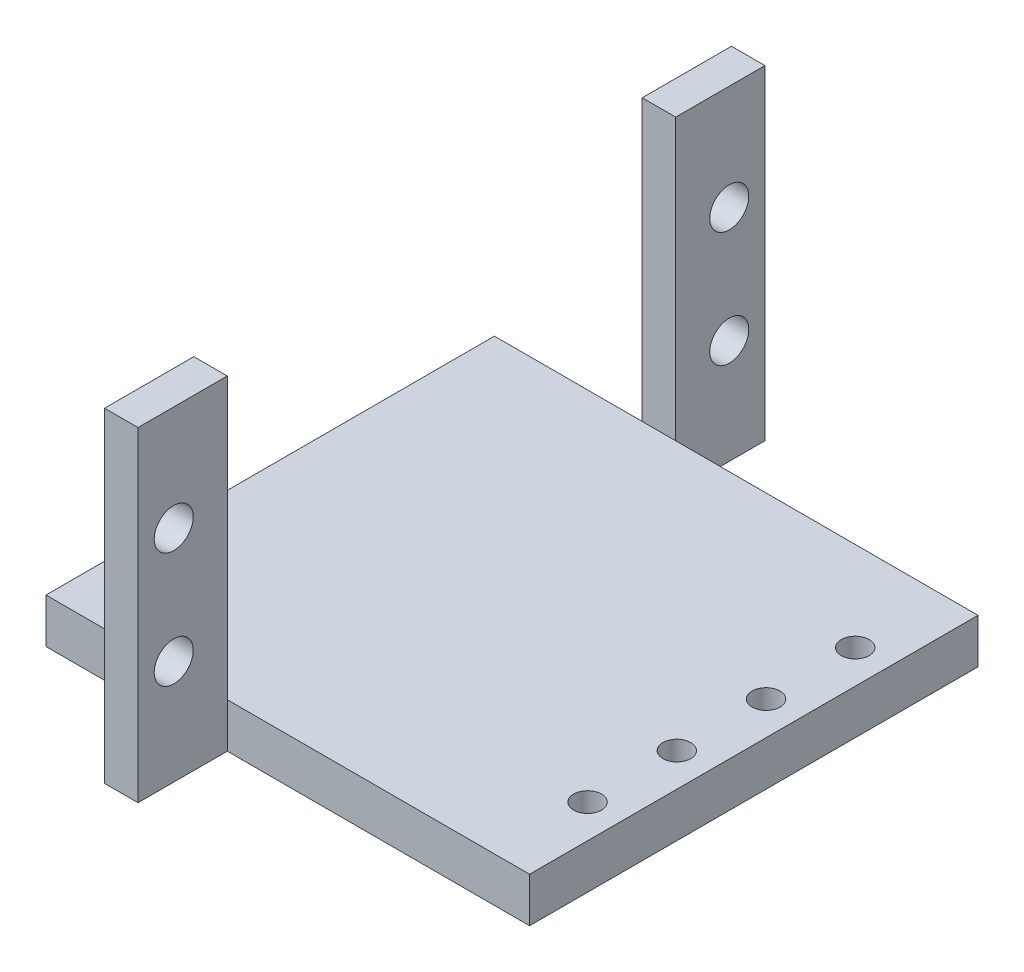
ISO-10303-21;
HEADER;
FILE_DESCRIPTION(('STEP AP214'),'2;1');
FILE_NAME('part.step','',(''),(''),'','','');
FILE_SCHEMA(('AUTOMOTIVE_DESIGN { 1 0 10303 214 1 1 1 1 }'));
ENDSEC;
DATA;
#1=APPLICATION_CONTEXT('core data for automotive mechanical design processes');
#2=APPLICATION_PROTOCOL_DEFINITION('international standard','automotive_design',2000,#1);
#3=PRODUCT_CONTEXT('',#1,'mechanical');
#4=PRODUCT('Part','Part','',(#3));
#5=PRODUCT_RELATED_PRODUCT_CATEGORY('part','',(#4));
#6=PRODUCT_DEFINITION_FORMATION('','',#4);
#7=PRODUCT_DEFINITION_CONTEXT('part definition',#1,'design');
#8=PRODUCT_DEFINITION('design','',#6,#7);
#9=PRODUCT_DEFINITION_SHAPE('','',#8);
#10=(LENGTH_UNIT() NAMED_UNIT(*) SI_UNIT(.MILLI.,.METRE.));
#11=(NAMED_UNIT(*) PLANE_ANGLE_UNIT() SI_UNIT($,.RADIAN.));
#12=(NAMED_UNIT(*) SI_UNIT($,.STERADIAN.) SOLID_ANGLE_UNIT());
#13=UNCERTAINTY_MEASURE_WITH_UNIT(LENGTH_MEASURE(1.E-05),#10,'distance_accuracy_value','');
#14=(GEOMETRIC_REPRESENTATION_CONTEXT(3) GLOBAL_UNCERTAINTY_ASSIGNED_CONTEXT((#13)) GLOBAL_UNIT_ASSIGNED_CONTEXT((#10,
#11,#12)) REPRESENTATION_CONTEXT('',''));
#15=CARTESIAN_POINT('',(0.,0.,0.));
#16=DIRECTION('',(0.,0.,1.));
#17=DIRECTION('',(1.,0.,0.));
#18=AXIS2_PLACEMENT_3D('',#15,#16,#17);
#19=CARTESIAN_POINT('',(0.,4.,0.));
#20=DIRECTION('',(0.,-1.,0.));
#21=DIRECTION('',(0.,0.,-1.));
#22=AXIS2_PLACEMENT_3D('',#19,#20,#21);
#23=PLANE('',#22);
#24=CARTESIAN_POINT('',(-36.7246909264262,4.,-24.2));
#25=DIRECTION('',(0.,1.,0.));
#26=DIRECTION('',(0.,0.,1.));
#27=AXIS2_PLACEMENT_3D('',#24,#25,#26);
#28=CIRCLE('',#27,1.25);
#29=CARTESIAN_POINT('',(-36.7246909264262,4.,-22.95));
#30=VERTEX_POINT('',#29);
#31=EDGE_CURVE('E289',#30,#30,#28,.T.);
#32=ORIENTED_EDGE('',*,*,#31,.F.);
#33=EDGE_LOOP('',(#32));
#34=FACE_BOUND('',#33,.T.);
#35=CARTESIAN_POINT('',(-36.7246909264262,4.,-16.2));
#36=DIRECTION('',(0.,1.,0.));
#37=DIRECTION('',(0.,0.,1.));
#38=AXIS2_PLACEMENT_3D('',#35,#36,#37);
#39=CIRCLE('',#38,1.25);
#40=CARTESIAN_POINT('',(-36.7246909264262,4.,-14.95));
#41=VERTEX_POINT('',#40);
#42=EDGE_CURVE('E621',#41,#41,#39,.T.);
#43=ORIENTED_EDGE('',*,*,#42,.F.);
#44=EDGE_LOOP('',(#43));
#45=FACE_BOUND('',#44,.T.);
#46=CARTESIAN_POINT('',(-36.7246909264262,4.,-8.19999999999993));
#47=DIRECTION('',(0.,1.,0.));
#48=DIRECTION('',(0.,0.,1.));
#49=AXIS2_PLACEMENT_3D('',#46,#47,#48);
#50=CIRCLE('',#49,1.25);
#51=CARTESIAN_POINT('',(-36.7246909264262,4.,-6.94999999999993));
#52=VERTEX_POINT('',#51);
#53=EDGE_CURVE('E624',#52,#52,#50,.T.);
#54=ORIENTED_EDGE('',*,*,#53,.F.);
#55=EDGE_LOOP('',(#54));
#56=FACE_BOUND('',#55,.T.);
#57=CARTESIAN_POINT('',(-36.7246909264262,4.,-32.1920206938082));
#58=DIRECTION('',(0.,1.,0.));
#59=DIRECTION('',(0.,0.,1.));
#60=AXIS2_PLACEMENT_3D('',#57,#58,#59);
#61=CIRCLE('',#60,1.25);
#62=CARTESIAN_POINT('',(-36.7246909264262,4.,-30.9420206938082));
#63=VERTEX_POINT('',#62);
#64=EDGE_CURVE('E170',#63,#63,#61,.T.);
#65=ORIENTED_EDGE('',*,*,#64,.F.);
#66=EDGE_LOOP('',(#65));
#67=FACE_BOUND('',#66,.T.);
#68=DIRECTION('',(1.,0.,0.));
#69=VECTOR('',#68,1.);
#70=CARTESIAN_POINT('',(-60.8246909264262,4.,-40.2));
#71=LINE('',#70,#69);
#72=CARTESIAN_POINT('',(-63.8246909264262,4.,-40.2));
#73=VERTEX_POINT('',#72);
#74=CARTESIAN_POINT('',(-60.8246909264262,4.,-40.2));
#75=VERTEX_POINT('',#74);
#76=EDGE_CURVE('E197',#73,#75,#71,.T.);
#77=ORIENTED_EDGE('',*,*,#76,.F.);
#78=DIRECTION('',(-1.,0.,0.));
#79=VECTOR('',#78,1.);
#80=CARTESIAN_POINT('',(-77.0746909264262,4.,-40.2));
#81=LINE('',#80,#79);
#82=CARTESIAN_POINT('',(-77.0746909264262,4.,-40.2));
#83=VERTEX_POINT('',#82);
#84=EDGE_CURVE('E51',#73,#83,#81,.T.);
#85=ORIENTED_EDGE('',*,*,#84,.T.);
#86=DIRECTION('',(0.,0.,1.));
#87=VECTOR('',#86,1.);
#88=CARTESIAN_POINT('',(-77.0746909264262,4.,0.));
#89=LINE('',#88,#87);
#90=CARTESIAN_POINT('',(-77.0746909264262,4.,0.));
#91=VERTEX_POINT('',#90);
#92=EDGE_CURVE('E236',#83,#91,#89,.T.);
#93=ORIENTED_EDGE('',*,*,#92,.T.);
#94=DIRECTION('',(1.,0.,0.));
#95=VECTOR('',#94,1.);
#96=CARTESIAN_POINT('',(-77.0746909264262,4.,0.));
#97=LINE('',#96,#95);
#98=CARTESIAN_POINT('',(-63.8246909264262,4.,0.));
#99=VERTEX_POINT('',#98);
#100=EDGE_CURVE('E101',#91,#99,#97,.T.);
#101=ORIENTED_EDGE('',*,*,#100,.T.);
#102=DIRECTION('',(-1.,0.,0.));
#103=VECTOR('',#102,1.);
#104=CARTESIAN_POINT('',(-60.8246909264262,4.,0.));
#105=LINE('',#104,#103);
#106=CARTESIAN_POINT('',(-60.8246909264262,4.,0.));
#107=VERTEX_POINT('',#106);
#108=EDGE_CURVE('E215',#107,#99,#105,.T.);
#109=ORIENTED_EDGE('',*,*,#108,.F.);
#110=DIRECTION('',(1.,0.,0.));
#111=VECTOR('',#110,1.);
#112=CARTESIAN_POINT('',(-60.8246909264262,4.,0.));
#113=LINE('',#112,#111);
#114=CARTESIAN_POINT('',(-33.7246909264262,4.,0.));
#115=VERTEX_POINT('',#114);
#116=EDGE_CURVE('E153',#107,#115,#113,.T.);
#117=ORIENTED_EDGE('',*,*,#116,.T.);
#118=DIRECTION('',(0.,0.,1.));
#119=VECTOR('',#118,1.);
#120=CARTESIAN_POINT('',(-33.7246909264262,4.,-40.2));
#121=LINE('',#120,#119);
#122=CARTESIAN_POINT('',(-33.7246909264262,4.,-40.2));
#123=VERTEX_POINT('',#122);
#124=EDGE_CURVE('E156',#123,#115,#121,.T.);
#125=ORIENTED_EDGE('',*,*,#124,.F.);
#126=DIRECTION('',(-1.,0.,0.));
#127=VECTOR('',#126,1.);
#128=CARTESIAN_POINT('',(-60.8246909264262,4.,-40.2));
#129=LINE('',#128,#127);
#130=EDGE_CURVE('E145',#123,#75,#129,.T.);
#131=ORIENTED_EDGE('',*,*,#130,.T.);
#132=EDGE_LOOP('',(#77,#85,#93,#101,#109,#117,#125,#131));
#133=FACE_BOUND('',#132,.T.);
#134=ADVANCED_FACE('F32',(#34,#45,#56,#67,#133),#23,.F.);
#135=CARTESIAN_POINT('',(-77.0746909264262,4.,0.));
#136=DIRECTION('',(1.,0.,0.));
#137=DIRECTION('',(0.,0.,-1.));
#138=AXIS2_PLACEMENT_3D('',#135,#136,#137);
#139=PLANE('',#138);
#140=DIRECTION('',(0.,0.,1.));
#141=VECTOR('',#140,1.);
#142=CARTESIAN_POINT('',(-77.0746909264262,0.,0.));
#143=LINE('',#142,#141);
#144=CARTESIAN_POINT('',(-77.0746909264262,0.,-40.2));
#145=VERTEX_POINT('',#144);
#146=CARTESIAN_POINT('',(-77.0746909264262,0.,0.));
#147=VERTEX_POINT('',#146);
#148=EDGE_CURVE('E235',#145,#147,#143,.T.);
#149=ORIENTED_EDGE('',*,*,#148,.T.);
#150=DIRECTION('',(0.,-1.,0.));
#151=VECTOR('',#150,1.);
#152=CARTESIAN_POINT('',(-77.0746909264262,4.,0.));
#153=LINE('',#152,#151);
#154=EDGE_CURVE('E11',#91,#147,#153,.T.);
#155=ORIENTED_EDGE('',*,*,#154,.F.);
#156=ORIENTED_EDGE('',*,*,#92,.F.);
#157=DIRECTION('',(0.,-1.,0.));
#158=VECTOR('',#157,1.);
#159=CARTESIAN_POINT('',(-77.0746909264262,4.,-40.2));
#160=LINE('',#159,#158);
#161=EDGE_CURVE('E241',#83,#145,#160,.T.);
#162=ORIENTED_EDGE('',*,*,#161,.T.);
#163=EDGE_LOOP('',(#149,#155,#156,#162));
#164=FACE_BOUND('',#163,.T.);
#165=ADVANCED_FACE('F34',(#164),#139,.F.);
#166=CARTESIAN_POINT('',(-77.0746909264262,4.,0.));
#167=DIRECTION('',(0.,0.,-1.));
#168=DIRECTION('',(-1.,0.,0.));
#169=AXIS2_PLACEMENT_3D('',#166,#167,#168);
#170=PLANE('',#169);
#171=DIRECTION('',(1.,0.,0.));
#172=VECTOR('',#171,1.);
#173=CARTESIAN_POINT('',(-77.0746909264262,0.,0.));
#174=LINE('',#173,#172);
#175=CARTESIAN_POINT('',(-63.8246909264262,0.,0.));
#176=VERTEX_POINT('',#175);
#177=EDGE_CURVE('E244',#147,#176,#174,.T.);
#178=ORIENTED_EDGE('',*,*,#177,.T.);
#179=DIRECTION('',(0.,-1.,0.));
#180=VECTOR('',#179,1.);
#181=CARTESIAN_POINT('',(-63.8246909264262,4.,0.));
#182=LINE('',#181,#180);
#183=EDGE_CURVE('E42',#99,#176,#182,.T.);
#184=ORIENTED_EDGE('',*,*,#183,.F.);
#185=ORIENTED_EDGE('',*,*,#100,.F.);
#186=ORIENTED_EDGE('',*,*,#154,.T.);
#187=EDGE_LOOP('',(#178,#184,#185,#186));
#188=FACE_BOUND('',#187,.T.);
#189=ADVANCED_FACE('F307',(#188),#170,.F.);
#190=CARTESIAN_POINT('',(-63.8246909264262,4.,0.));
#191=DIRECTION('',(1.,0.,0.));
#192=DIRECTION('',(0.,0.,-1.));
#193=AXIS2_PLACEMENT_3D('',#190,#191,#192);
#194=PLANE('',#193);
#195=CARTESIAN_POINT('',(-63.8246909264262,9.375,4.79999998672757));
#196=DIRECTION('',(-1.,0.,0.));
#197=DIRECTION('',(0.,0.,1.));
#198=AXIS2_PLACEMENT_3D('',#195,#196,#197);
#199=CIRCLE('',#198,1.75);
#200=CARTESIAN_POINT('',(-63.8246909264262,9.375,6.54999998672757));
#201=VERTEX_POINT('',#200);
#202=EDGE_CURVE('E178',#201,#201,#199,.T.);
#203=ORIENTED_EDGE('',*,*,#202,.F.);
#204=EDGE_LOOP('',(#203));
#205=FACE_BOUND('',#204,.T.);
#206=CARTESIAN_POINT('',(-63.8246909264262,19.725,4.79999998672757));
#207=DIRECTION('',(-1.,0.,0.));
#208=DIRECTION('',(0.,0.,1.));
#209=AXIS2_PLACEMENT_3D('',#206,#207,#208);
#210=CIRCLE('',#209,1.750000009066);
#211=CARTESIAN_POINT('',(-63.8246909264262,19.725,6.54999999579357));
#212=VERTEX_POINT('',#211);
#213=EDGE_CURVE('E177',#212,#212,#210,.T.);
#214=ORIENTED_EDGE('',*,*,#213,.F.);
#215=EDGE_LOOP('',(#214));
#216=FACE_BOUND('',#215,.T.);
#217=DIRECTION('',(0.,0.,1.));
#218=VECTOR('',#217,1.);
#219=CARTESIAN_POINT('',(-63.8246909264262,0.,0.));
#220=LINE('',#219,#218);
#221=CARTESIAN_POINT('',(-63.8246909264262,0.,8.));
#222=VERTEX_POINT('',#221);
#223=EDGE_CURVE('E246',#176,#222,#220,.T.);
#224=ORIENTED_EDGE('',*,*,#223,.T.);
#225=DIRECTION('',(0.,-1.,0.));
#226=VECTOR('',#225,1.);
#227=CARTESIAN_POINT('',(-63.8246909264262,4.,8.));
#228=LINE('',#227,#226);
#229=CARTESIAN_POINT('',(-63.8246909264262,29.13,8.));
#230=VERTEX_POINT('',#229);
#231=EDGE_CURVE('E277',#230,#222,#228,.T.);
#232=ORIENTED_EDGE('',*,*,#231,.F.);
#233=DIRECTION('',(0.,0.,1.));
#234=VECTOR('',#233,1.);
#235=CARTESIAN_POINT('',(-63.8246909264262,29.13,0.));
#236=LINE('',#235,#234);
#237=CARTESIAN_POINT('',(-63.8246909264262,29.13,0.));
#238=VERTEX_POINT('',#237);
#239=EDGE_CURVE('E221',#238,#230,#236,.T.);
#240=ORIENTED_EDGE('',*,*,#239,.F.);
#241=DIRECTION('',(0.,-1.,0.));
#242=VECTOR('',#241,1.);
#243=CARTESIAN_POINT('',(-63.8246909264262,29.13,0.));
#244=LINE('',#243,#242);
#245=EDGE_CURVE('E227',#238,#99,#244,.T.);
#246=ORIENTED_EDGE('',*,*,#245,.T.);
#247=ORIENTED_EDGE('',*,*,#183,.T.);
#248=EDGE_LOOP('',(#224,#232,#240,#246,#247));
#249=FACE_BOUND('',#248,.T.);
#250=ADVANCED_FACE('F347',(#205,#216,#249),#194,.F.);
#251=CARTESIAN_POINT('',(-63.8246909264262,4.,8.));
#252=DIRECTION('',(0.,0.,-1.));
#253=DIRECTION('',(-1.,0.,0.));
#254=AXIS2_PLACEMENT_3D('',#251,#252,#253);
#255=PLANE('',#254);
#256=DIRECTION('',(1.,0.,0.));
#257=VECTOR('',#256,1.);
#258=CARTESIAN_POINT('',(-63.8246909264262,0.,8.));
#259=LINE('',#258,#257);
#260=CARTESIAN_POINT('',(-60.8246909264262,0.,8.));
#261=VERTEX_POINT('',#260);
#262=EDGE_CURVE('E248',#222,#261,#259,.T.);
#263=ORIENTED_EDGE('',*,*,#262,.T.);
#264=DIRECTION('',(0.,-1.,0.));
#265=VECTOR('',#264,1.);
#266=CARTESIAN_POINT('',(-60.8246909264262,4.,8.));
#267=LINE('',#266,#265);
#268=CARTESIAN_POINT('',(-60.8246909264262,29.13,8.));
#269=VERTEX_POINT('',#268);
#270=EDGE_CURVE('E274',#269,#261,#267,.T.);
#271=ORIENTED_EDGE('',*,*,#270,.F.);
#272=DIRECTION('',(1.,0.,0.));
#273=VECTOR('',#272,1.);
#274=CARTESIAN_POINT('',(-60.8246909264262,29.13,8.));
#275=LINE('',#274,#273);
#276=EDGE_CURVE('E224',#230,#269,#275,.T.);
#277=ORIENTED_EDGE('',*,*,#276,.F.);
#278=ORIENTED_EDGE('',*,*,#231,.T.);
#279=EDGE_LOOP('',(#263,#271,#277,#278));
#280=FACE_BOUND('',#279,.T.);
#281=ADVANCED_FACE('F343',(#280),#255,.F.);
#282=CARTESIAN_POINT('',(-60.8246909264262,4.,8.));
#283=DIRECTION('',(-1.,0.,0.));
#284=DIRECTION('',(0.,0.,1.));
#285=AXIS2_PLACEMENT_3D('',#282,#283,#284);
#286=PLANE('',#285);
#287=CARTESIAN_POINT('',(-60.8246909264262,9.375,4.79999998672757));
#288=DIRECTION('',(-1.,0.,0.));
#289=DIRECTION('',(0.,0.,1.));
#290=AXIS2_PLACEMENT_3D('',#287,#288,#289);
#291=CIRCLE('',#290,1.75);
#292=CARTESIAN_POINT('',(-60.8246909264262,9.375,6.54999998672757));
#293=VERTEX_POINT('',#292);
#294=EDGE_CURVE('E194',#293,#293,#291,.T.);
#295=ORIENTED_EDGE('',*,*,#294,.T.);
#296=EDGE_LOOP('',(#295));
#297=FACE_BOUND('',#296,.T.);
#298=CARTESIAN_POINT('',(-60.8246909264262,19.725,4.79999998672757));
#299=DIRECTION('',(-1.,0.,0.));
#300=DIRECTION('',(0.,0.,1.));
#301=AXIS2_PLACEMENT_3D('',#298,#299,#300);
#302=CIRCLE('',#301,1.750000009066);
#303=CARTESIAN_POINT('',(-60.8246909264262,19.725,6.54999999579357));
#304=VERTEX_POINT('',#303);
#305=EDGE_CURVE('E189',#304,#304,#302,.T.);
#306=ORIENTED_EDGE('',*,*,#305,.T.);
#307=EDGE_LOOP('',(#306));
#308=FACE_BOUND('',#307,.T.);
#309=DIRECTION('',(0.,0.,-1.));
#310=VECTOR('',#309,1.);
#311=CARTESIAN_POINT('',(-60.8246909264262,0.,8.));
#312=LINE('',#311,#310);
#313=CARTESIAN_POINT('',(-60.8246909264262,0.,0.));
#314=VERTEX_POINT('',#313);
#315=EDGE_CURVE('E250',#261,#314,#312,.T.);
#316=ORIENTED_EDGE('',*,*,#315,.T.);
#317=DIRECTION('',(0.,-1.,0.));
#318=VECTOR('',#317,1.);
#319=CARTESIAN_POINT('',(-60.8246909264262,4.,0.));
#320=LINE('',#319,#318);
#321=EDGE_CURVE('E271',#107,#314,#320,.T.);
#322=ORIENTED_EDGE('',*,*,#321,.F.);
#323=DIRECTION('',(0.,-1.,0.));
#324=VECTOR('',#323,1.);
#325=CARTESIAN_POINT('',(-60.8246909264262,29.13,0.));
#326=LINE('',#325,#324);
#327=CARTESIAN_POINT('',(-60.8246909264262,29.13,0.));
#328=VERTEX_POINT('',#327);
#329=EDGE_CURVE('E232',#328,#107,#326,.T.);
#330=ORIENTED_EDGE('',*,*,#329,.F.);
#331=DIRECTION('',(0.,0.,-1.));
#332=VECTOR('',#331,1.);
#333=CARTESIAN_POINT('',(-60.8246909264262,29.13,0.));
#334=LINE('',#333,#332);
#335=EDGE_CURVE('E216',#269,#328,#334,.T.);
#336=ORIENTED_EDGE('',*,*,#335,.F.);
#337=ORIENTED_EDGE('',*,*,#270,.T.);
#338=EDGE_LOOP('',(#316,#322,#330,#336,#337));
#339=FACE_BOUND('',#338,.T.);
#340=ADVANCED_FACE('F339',(#297,#308,#339),#286,.F.);
#341=CARTESIAN_POINT('',(-60.8246909264262,4.,0.));
#342=DIRECTION('',(0.,0.,-1.));
#343=DIRECTION('',(-1.,0.,0.));
#344=AXIS2_PLACEMENT_3D('',#341,#342,#343);
#345=PLANE('',#344);
#346=DIRECTION('',(1.,0.,0.));
#347=VECTOR('',#346,1.);
#348=CARTESIAN_POINT('',(-60.8246909264262,0.,0.));
#349=LINE('',#348,#347);
#350=CARTESIAN_POINT('',(-33.7246909264262,0.,0.));
#351=VERTEX_POINT('',#350);
#352=EDGE_CURVE('E252',#314,#351,#349,.T.);
#353=ORIENTED_EDGE('',*,*,#352,.T.);
#354=DIRECTION('',(0.,-1.,0.));
#355=VECTOR('',#354,1.);
#356=CARTESIAN_POINT('',(-33.7246909264262,0.,0.));
#357=LINE('',#356,#355);
#358=EDGE_CURVE('E161',#115,#351,#357,.T.);
#359=ORIENTED_EDGE('',*,*,#358,.F.);
#360=ORIENTED_EDGE('',*,*,#116,.F.);
#361=ORIENTED_EDGE('',*,*,#321,.T.);
#362=EDGE_LOOP('',(#353,#359,#360,#361));
#363=FACE_BOUND('',#362,.T.);
#364=ADVANCED_FACE('F336',(#363),#345,.F.);
#365=CARTESIAN_POINT('',(-60.8246909264262,4.,-40.2));
#366=DIRECTION('',(0.,0.,1.));
#367=DIRECTION('',(1.,0.,0.));
#368=AXIS2_PLACEMENT_3D('',#365,#366,#367);
#369=PLANE('',#368);
#370=DIRECTION('',(-1.,0.,0.));
#371=VECTOR('',#370,1.);
#372=CARTESIAN_POINT('',(-60.8246909264262,0.,-40.2));
#373=LINE('',#372,#371);
#374=CARTESIAN_POINT('',(-33.7246909264262,0.,-40.2));
#375=VERTEX_POINT('',#374);
#376=CARTESIAN_POINT('',(-60.8246909264262,0.,-40.2));
#377=VERTEX_POINT('',#376);
#378=EDGE_CURVE('E254',#375,#377,#373,.T.);
#379=ORIENTED_EDGE('',*,*,#378,.T.);
#380=DIRECTION('',(0.,-1.,0.));
#381=VECTOR('',#380,1.);
#382=CARTESIAN_POINT('',(-60.8246909264262,4.,-40.2));
#383=LINE('',#382,#381);
#384=EDGE_CURVE('E151',#75,#377,#383,.T.);
#385=ORIENTED_EDGE('',*,*,#384,.F.);
#386=ORIENTED_EDGE('',*,*,#130,.F.);
#387=DIRECTION('',(0.,1.,0.));
#388=VECTOR('',#387,1.);
#389=CARTESIAN_POINT('',(-33.7246909264262,0.,-40.2));
#390=LINE('',#389,#388);
#391=EDGE_CURVE('E149',#375,#123,#390,.T.);
#392=ORIENTED_EDGE('',*,*,#391,.F.);
#393=EDGE_LOOP('',(#379,#385,#386,#392));
#394=FACE_BOUND('',#393,.T.);
#395=ADVANCED_FACE('F147',(#394),#369,.F.);
#396=CARTESIAN_POINT('',(-60.8246909264262,4.,-48.2));
#397=DIRECTION('',(-1.,0.,0.));
#398=DIRECTION('',(0.,0.,1.));
#399=AXIS2_PLACEMENT_3D('',#396,#397,#398);
#400=PLANE('',#399);
#401=CARTESIAN_POINT('',(-60.8246909264262,19.725,-44.9999999999991));
#402=DIRECTION('',(-1.,0.,0.));
#403=DIRECTION('',(0.,0.,1.));
#404=AXIS2_PLACEMENT_3D('',#401,#402,#403);
#405=CIRCLE('',#404,1.75);
#406=CARTESIAN_POINT('',(-60.8246909264262,19.725,-43.2499999999991));
#407=VERTEX_POINT('',#406);
#408=EDGE_CURVE('E181',#407,#407,#405,.T.);
#409=ORIENTED_EDGE('',*,*,#408,.T.);
#410=EDGE_LOOP('',(#409));
#411=FACE_BOUND('',#410,.T.);
#412=CARTESIAN_POINT('',(-60.8246909264262,9.375,-44.9999999999991));
#413=DIRECTION('',(-1.,0.,0.));
#414=DIRECTION('',(0.,0.,1.));
#415=AXIS2_PLACEMENT_3D('',#412,#413,#414);
#416=CIRCLE('',#415,1.75);
#417=CARTESIAN_POINT('',(-60.8246909264262,9.375,-43.2499999999991));
#418=VERTEX_POINT('',#417);
#419=EDGE_CURVE('E193',#418,#418,#416,.T.);
#420=ORIENTED_EDGE('',*,*,#419,.T.);
#421=EDGE_LOOP('',(#420));
#422=FACE_BOUND('',#421,.T.);
#423=DIRECTION('',(0.,0.,-1.));
#424=VECTOR('',#423,1.);
#425=CARTESIAN_POINT('',(-60.8246909264262,0.,-48.2));
#426=LINE('',#425,#424);
#427=CARTESIAN_POINT('',(-60.8246909264262,0.,-48.2));
#428=VERTEX_POINT('',#427);
#429=EDGE_CURVE('E256',#377,#428,#426,.T.);
#430=ORIENTED_EDGE('',*,*,#429,.T.);
#431=DIRECTION('',(0.,-1.,0.));
#432=VECTOR('',#431,1.);
#433=CARTESIAN_POINT('',(-60.8246909264262,4.,-48.2));
#434=LINE('',#433,#432);
#435=CARTESIAN_POINT('',(-60.8246909264262,29.13,-48.2));
#436=VERTEX_POINT('',#435);
#437=EDGE_CURVE('E267',#436,#428,#434,.T.);
#438=ORIENTED_EDGE('',*,*,#437,.F.);
#439=DIRECTION('',(0.,0.,-1.));
#440=VECTOR('',#439,1.);
#441=CARTESIAN_POINT('',(-60.8246909264262,29.13,-40.2));
#442=LINE('',#441,#440);
#443=CARTESIAN_POINT('',(-60.8246909264262,29.13,-40.2));
#444=VERTEX_POINT('',#443);
#445=EDGE_CURVE('E198',#444,#436,#442,.T.);
#446=ORIENTED_EDGE('',*,*,#445,.F.);
#447=DIRECTION('',(0.,-1.,0.));
#448=VECTOR('',#447,1.);
#449=CARTESIAN_POINT('',(-60.8246909264262,29.13,-40.2));
#450=LINE('',#449,#448);
#451=EDGE_CURVE('E208',#444,#75,#450,.T.);
#452=ORIENTED_EDGE('',*,*,#451,.T.);
#453=ORIENTED_EDGE('',*,*,#384,.T.);
#454=EDGE_LOOP('',(#430,#438,#446,#452,#453));
#455=FACE_BOUND('',#454,.T.);
#456=ADVANCED_FACE('F329',(#411,#422,#455),#400,.F.);
#457=CARTESIAN_POINT('',(-63.8246909264262,4.,-48.2));
#458=DIRECTION('',(0.,0.,1.));
#459=DIRECTION('',(1.,0.,0.));
#460=AXIS2_PLACEMENT_3D('',#457,#458,#459);
#461=PLANE('',#460);
#462=DIRECTION('',(-1.,0.,0.));
#463=VECTOR('',#462,1.);
#464=CARTESIAN_POINT('',(-63.8246909264262,0.,-48.2));
#465=LINE('',#464,#463);
#466=CARTESIAN_POINT('',(-63.8246909264262,0.,-48.2));
#467=VERTEX_POINT('',#466);
#468=EDGE_CURVE('E258',#428,#467,#465,.T.);
#469=ORIENTED_EDGE('',*,*,#468,.T.);
#470=DIRECTION('',(0.,-1.,0.));
#471=VECTOR('',#470,1.);
#472=CARTESIAN_POINT('',(-63.8246909264262,4.,-48.2));
#473=LINE('',#472,#471);
#474=CARTESIAN_POINT('',(-63.8246909264262,29.13,-48.2));
#475=VERTEX_POINT('',#474);
#476=EDGE_CURVE('E265',#475,#467,#473,.T.);
#477=ORIENTED_EDGE('',*,*,#476,.F.);
#478=DIRECTION('',(-1.,0.,0.));
#479=VECTOR('',#478,1.);
#480=CARTESIAN_POINT('',(-60.8246909264262,29.13,-48.2));
#481=LINE('',#480,#479);
#482=EDGE_CURVE('E201',#436,#475,#481,.T.);
#483=ORIENTED_EDGE('',*,*,#482,.F.);
#484=ORIENTED_EDGE('',*,*,#437,.T.);
#485=EDGE_LOOP('',(#469,#477,#483,#484));
#486=FACE_BOUND('',#485,.T.);
#487=ADVANCED_FACE('F325',(#486),#461,.F.);
#488=CARTESIAN_POINT('',(-63.8246909264262,4.,-40.2));
#489=DIRECTION('',(1.,0.,0.));
#490=DIRECTION('',(0.,0.,-1.));
#491=AXIS2_PLACEMENT_3D('',#488,#489,#490);
#492=PLANE('',#491);
#493=CARTESIAN_POINT('',(-63.8246909264262,19.725,-44.9999999999991));
#494=DIRECTION('',(-1.,0.,0.));
#495=DIRECTION('',(0.,0.,1.));
#496=AXIS2_PLACEMENT_3D('',#493,#494,#495);
#497=CIRCLE('',#496,1.75);
#498=CARTESIAN_POINT('',(-63.8246909264262,19.725,-43.2499999999991));
#499=VERTEX_POINT('',#498);
#500=EDGE_CURVE('E182',#499,#499,#497,.T.);
#501=ORIENTED_EDGE('',*,*,#500,.F.);
#502=EDGE_LOOP('',(#501));
#503=FACE_BOUND('',#502,.T.);
#504=CARTESIAN_POINT('',(-63.8246909264262,9.375,-44.9999999999991));
#505=DIRECTION('',(-1.,0.,0.));
#506=DIRECTION('',(0.,0.,1.));
#507=AXIS2_PLACEMENT_3D('',#504,#505,#506);
#508=CIRCLE('',#507,1.75);
#509=CARTESIAN_POINT('',(-63.8246909264262,9.375,-43.2499999999991));
#510=VERTEX_POINT('',#509);
#511=EDGE_CURVE('E190',#510,#510,#508,.T.);
#512=ORIENTED_EDGE('',*,*,#511,.F.);
#513=EDGE_LOOP('',(#512));
#514=FACE_BOUND('',#513,.T.);
#515=DIRECTION('',(0.,0.,1.));
#516=VECTOR('',#515,1.);
#517=CARTESIAN_POINT('',(-63.8246909264262,0.,-40.2));
#518=LINE('',#517,#516);
#519=CARTESIAN_POINT('',(-63.8246909264262,0.,-40.2));
#520=VERTEX_POINT('',#519);
#521=EDGE_CURVE('E88',#467,#520,#518,.T.);
#522=ORIENTED_EDGE('',*,*,#521,.T.);
#523=DIRECTION('',(0.,-1.,0.));
#524=VECTOR('',#523,1.);
#525=CARTESIAN_POINT('',(-63.8246909264262,4.,-40.2));
#526=LINE('',#525,#524);
#527=EDGE_CURVE('E263',#73,#520,#526,.T.);
#528=ORIENTED_EDGE('',*,*,#527,.F.);
#529=DIRECTION('',(0.,-1.,0.));
#530=VECTOR('',#529,1.);
#531=CARTESIAN_POINT('',(-63.8246909264262,29.13,-40.2));
#532=LINE('',#531,#530);
#533=CARTESIAN_POINT('',(-63.8246909264262,29.13,-40.2));
#534=VERTEX_POINT('',#533);
#535=EDGE_CURVE('E212',#534,#73,#532,.T.);
#536=ORIENTED_EDGE('',*,*,#535,.F.);
#537=DIRECTION('',(0.,0.,1.));
#538=VECTOR('',#537,1.);
#539=CARTESIAN_POINT('',(-63.8246909264262,29.13,-40.2));
#540=LINE('',#539,#538);
#541=EDGE_CURVE('E204',#475,#534,#540,.T.);
#542=ORIENTED_EDGE('',*,*,#541,.F.);
#543=ORIENTED_EDGE('',*,*,#476,.T.);
#544=EDGE_LOOP('',(#522,#528,#536,#542,#543));
#545=FACE_BOUND('',#544,.T.);
#546=ADVANCED_FACE('F322',(#503,#514,#545),#492,.F.);
#547=CARTESIAN_POINT('',(-77.0746909264262,4.,-40.2));
#548=DIRECTION('',(0.,0.,1.));
#549=DIRECTION('',(1.,0.,0.));
#550=AXIS2_PLACEMENT_3D('',#547,#548,#549);
#551=PLANE('',#550);
#552=DIRECTION('',(-1.,0.,0.));
#553=VECTOR('',#552,1.);
#554=CARTESIAN_POINT('',(-77.0746909264262,0.,-40.2));
#555=LINE('',#554,#553);
#556=EDGE_CURVE('E94',#520,#145,#555,.T.);
#557=ORIENTED_EDGE('',*,*,#556,.T.);
#558=ORIENTED_EDGE('',*,*,#161,.F.);
#559=ORIENTED_EDGE('',*,*,#84,.F.);
#560=ORIENTED_EDGE('',*,*,#527,.T.);
#561=EDGE_LOOP('',(#557,#558,#559,#560));
#562=FACE_BOUND('',#561,.T.);
#563=ADVANCED_FACE('F318',(#562),#551,.F.);
#564=CARTESIAN_POINT('',(0.,0.,0.));
#565=DIRECTION('',(0.,-1.,0.));
#566=DIRECTION('',(0.,0.,-1.));
#567=AXIS2_PLACEMENT_3D('',#564,#565,#566);
#568=PLANE('',#567);
#569=CARTESIAN_POINT('',(-36.7246909264262,0.,-24.2));
#570=DIRECTION('',(0.,-1.,0.));
#571=DIRECTION('',(0.,0.,-1.));
#572=AXIS2_PLACEMENT_3D('',#569,#570,#571);
#573=CIRCLE('',#572,1.25);
#574=CARTESIAN_POINT('',(-36.7246909264262,0.,-25.45));
#575=VERTEX_POINT('',#574);
#576=EDGE_CURVE('E36',#575,#575,#573,.T.);
#577=ORIENTED_EDGE('',*,*,#576,.F.);
#578=EDGE_LOOP('',(#577));
#579=FACE_BOUND('',#578,.T.);
#580=CARTESIAN_POINT('',(-36.7246909264262,0.,-16.2));
#581=DIRECTION('',(0.,-1.,0.));
#582=DIRECTION('',(0.,0.,-1.));
#583=AXIS2_PLACEMENT_3D('',#580,#581,#582);
#584=CIRCLE('',#583,1.25);
#585=CARTESIAN_POINT('',(-36.7246909264262,0.,-17.45));
#586=VERTEX_POINT('',#585);
#587=EDGE_CURVE('E288',#586,#586,#584,.T.);
#588=ORIENTED_EDGE('',*,*,#587,.F.);
#589=EDGE_LOOP('',(#588));
#590=FACE_BOUND('',#589,.T.);
#591=CARTESIAN_POINT('',(-36.7246909264262,0.,-8.19999999999993));
#592=DIRECTION('',(0.,-1.,0.));
#593=DIRECTION('',(0.,0.,-1.));
#594=AXIS2_PLACEMENT_3D('',#591,#592,#593);
#595=CIRCLE('',#594,1.25);
#596=CARTESIAN_POINT('',(-36.7246909264262,0.,-9.44999999999993));
#597=VERTEX_POINT('',#596);
#598=EDGE_CURVE('E286',#597,#597,#595,.T.);
#599=ORIENTED_EDGE('',*,*,#598,.F.);
#600=EDGE_LOOP('',(#599));
#601=FACE_BOUND('',#600,.T.);
#602=CARTESIAN_POINT('',(-36.7246909264262,0.,-32.1920206938082));
#603=DIRECTION('',(0.,-1.,0.));
#604=DIRECTION('',(0.,0.,-1.));
#605=AXIS2_PLACEMENT_3D('',#602,#603,#604);
#606=CIRCLE('',#605,1.25);
#607=CARTESIAN_POINT('',(-36.7246909264262,0.,-33.4420206938082));
#608=VERTEX_POINT('',#607);
#609=EDGE_CURVE('E167',#608,#608,#606,.T.);
#610=ORIENTED_EDGE('',*,*,#609,.F.);
#611=EDGE_LOOP('',(#610));
#612=FACE_BOUND('',#611,.T.);
#613=ORIENTED_EDGE('',*,*,#148,.F.);
#614=ORIENTED_EDGE('',*,*,#556,.F.);
#615=ORIENTED_EDGE('',*,*,#521,.F.);
#616=ORIENTED_EDGE('',*,*,#468,.F.);
#617=ORIENTED_EDGE('',*,*,#429,.F.);
#618=ORIENTED_EDGE('',*,*,#378,.F.);
#619=DIRECTION('',(0.,0.,-1.));
#620=VECTOR('',#619,1.);
#621=CARTESIAN_POINT('',(-33.7246909264262,0.,-40.2));
#622=LINE('',#621,#620);
#623=EDGE_CURVE('E166',#351,#375,#622,.T.);
#624=ORIENTED_EDGE('',*,*,#623,.F.);
#625=ORIENTED_EDGE('',*,*,#352,.F.);
#626=ORIENTED_EDGE('',*,*,#315,.F.);
#627=ORIENTED_EDGE('',*,*,#262,.F.);
#628=ORIENTED_EDGE('',*,*,#223,.F.);
#629=ORIENTED_EDGE('',*,*,#177,.F.);
#630=EDGE_LOOP('',(#613,#614,#615,#616,#617,#618,#624,#625,#626,#627,#628,#629));
#631=FACE_BOUND('',#630,.T.);
#632=ADVANCED_FACE('F315',(#579,#590,#601,#612,#631),#568,.T.);
#633=CARTESIAN_POINT('',(-60.8246909264262,29.13,0.));
#634=DIRECTION('',(0.,0.,1.));
#635=DIRECTION('',(1.,0.,0.));
#636=AXIS2_PLACEMENT_3D('',#633,#634,#635);
#637=PLANE('',#636);
#638=ORIENTED_EDGE('',*,*,#108,.T.);
#639=ORIENTED_EDGE('',*,*,#245,.F.);
#640=DIRECTION('',(-1.,0.,0.));
#641=VECTOR('',#640,1.);
#642=CARTESIAN_POINT('',(-60.8246909264262,29.13,0.));
#643=LINE('',#642,#641);
#644=EDGE_CURVE('E219',#328,#238,#643,.T.);
#645=ORIENTED_EDGE('',*,*,#644,.F.);
#646=ORIENTED_EDGE('',*,*,#329,.T.);
#647=EDGE_LOOP('',(#638,#639,#645,#646));
#648=FACE_BOUND('',#647,.T.);
#649=ADVANCED_FACE('F313',(#648),#637,.F.);
#650=CARTESIAN_POINT('',(0.,29.13,0.));
#651=DIRECTION('',(0.,-1.,0.));
#652=DIRECTION('',(0.,0.,-1.));
#653=AXIS2_PLACEMENT_3D('',#650,#651,#652);
#654=PLANE('',#653);
#655=ORIENTED_EDGE('',*,*,#335,.T.);
#656=ORIENTED_EDGE('',*,*,#644,.T.);
#657=ORIENTED_EDGE('',*,*,#239,.T.);
#658=ORIENTED_EDGE('',*,*,#276,.T.);
#659=EDGE_LOOP('',(#655,#656,#657,#658));
#660=FACE_BOUND('',#659,.T.);
#661=ADVANCED_FACE('F370',(#660),#654,.F.);
#662=CARTESIAN_POINT('',(-60.8246909264262,29.13,-40.2));
#663=DIRECTION('',(0.,0.,-1.));
#664=DIRECTION('',(-1.,0.,0.));
#665=AXIS2_PLACEMENT_3D('',#662,#663,#664);
#666=PLANE('',#665);
#667=ORIENTED_EDGE('',*,*,#76,.T.);
#668=ORIENTED_EDGE('',*,*,#451,.F.);
#669=DIRECTION('',(1.,0.,0.));
#670=VECTOR('',#669,1.);
#671=CARTESIAN_POINT('',(-60.8246909264262,29.13,-40.2));
#672=LINE('',#671,#670);
#673=EDGE_CURVE('E206',#534,#444,#672,.T.);
#674=ORIENTED_EDGE('',*,*,#673,.F.);
#675=ORIENTED_EDGE('',*,*,#535,.T.);
#676=EDGE_LOOP('',(#667,#668,#674,#675));
#677=FACE_BOUND('',#676,.T.);
#678=ADVANCED_FACE('F379',(#677),#666,.F.);
#679=CARTESIAN_POINT('',(0.,29.13,0.));
#680=DIRECTION('',(0.,1.,0.));
#681=DIRECTION('',(0.,0.,1.));
#682=AXIS2_PLACEMENT_3D('',#679,#680,#681);
#683=PLANE('',#682);
#684=ORIENTED_EDGE('',*,*,#445,.T.);
#685=ORIENTED_EDGE('',*,*,#482,.T.);
#686=ORIENTED_EDGE('',*,*,#541,.T.);
#687=ORIENTED_EDGE('',*,*,#673,.T.);
#688=EDGE_LOOP('',(#684,#685,#686,#687));
#689=FACE_BOUND('',#688,.T.);
#690=ADVANCED_FACE('F385',(#689),#683,.T.);
#691=CARTESIAN_POINT('',(-59.8246909264262,9.375,-44.9999999999991));
#692=DIRECTION('',(-1.,0.,0.));
#693=DIRECTION('',(0.,0.,1.));
#694=AXIS2_PLACEMENT_3D('',#691,#692,#693);
#695=CYLINDRICAL_SURFACE('',#694,1.75);
#696=ORIENTED_EDGE('',*,*,#511,.T.);
#697=EDGE_LOOP('',(#696));
#698=FACE_BOUND('',#697,.T.);
#699=ORIENTED_EDGE('',*,*,#419,.F.);
#700=EDGE_LOOP('',(#699));
#701=FACE_BOUND('',#700,.T.);
#702=ADVANCED_FACE('F387',(#698,#701),#695,.F.);
#703=CARTESIAN_POINT('',(-59.8246909264262,19.725,-44.9999999999991));
#704=DIRECTION('',(-1.,0.,0.));
#705=DIRECTION('',(0.,0.,1.));
#706=AXIS2_PLACEMENT_3D('',#703,#704,#705);
#707=CYLINDRICAL_SURFACE('',#706,1.75);
#708=ORIENTED_EDGE('',*,*,#500,.T.);
#709=EDGE_LOOP('',(#708));
#710=FACE_BOUND('',#709,.T.);
#711=ORIENTED_EDGE('',*,*,#408,.F.);
#712=EDGE_LOOP('',(#711));
#713=FACE_BOUND('',#712,.T.);
#714=ADVANCED_FACE('F393',(#710,#713),#707,.F.);
#715=CARTESIAN_POINT('',(-59.8246909264262,19.725,4.79999998672757));
#716=DIRECTION('',(-1.,0.,0.));
#717=DIRECTION('',(0.,0.,1.));
#718=AXIS2_PLACEMENT_3D('',#715,#716,#717);
#719=CYLINDRICAL_SURFACE('',#718,1.750000009066);
#720=ORIENTED_EDGE('',*,*,#213,.T.);
#721=EDGE_LOOP('',(#720));
#722=FACE_BOUND('',#721,.T.);
#723=ORIENTED_EDGE('',*,*,#305,.F.);
#724=EDGE_LOOP('',(#723));
#725=FACE_BOUND('',#724,.T.);
#726=ADVANCED_FACE('F571',(#722,#725),#719,.F.);
#727=CARTESIAN_POINT('',(-59.8246909264262,9.375,4.79999998672757));
#728=DIRECTION('',(-1.,0.,0.));
#729=DIRECTION('',(0.,0.,1.));
#730=AXIS2_PLACEMENT_3D('',#727,#728,#729);
#731=CYLINDRICAL_SURFACE('',#730,1.75);
#732=ORIENTED_EDGE('',*,*,#202,.T.);
#733=EDGE_LOOP('',(#732));
#734=FACE_BOUND('',#733,.T.);
#735=ORIENTED_EDGE('',*,*,#294,.F.);
#736=EDGE_LOOP('',(#735));
#737=FACE_BOUND('',#736,.T.);
#738=ADVANCED_FACE('F529',(#734,#737),#731,.F.);
#739=CARTESIAN_POINT('',(-33.7246909264262,0.,0.));
#740=DIRECTION('',(1.,0.,0.));
#741=DIRECTION('',(0.,0.,-1.));
#742=AXIS2_PLACEMENT_3D('',#739,#740,#741);
#743=PLANE('',#742);
#744=ORIENTED_EDGE('',*,*,#391,.T.);
#745=ORIENTED_EDGE('',*,*,#124,.T.);
#746=ORIENTED_EDGE('',*,*,#358,.T.);
#747=ORIENTED_EDGE('',*,*,#623,.T.);
#748=EDGE_LOOP('',(#744,#745,#746,#747));
#749=FACE_BOUND('',#748,.T.);
#750=ADVANCED_FACE('F164',(#749),#743,.T.);
#751=CARTESIAN_POINT('',(-36.7246909264262,-1.,-32.1920206938082));
#752=DIRECTION('',(0.,1.,0.));
#753=DIRECTION('',(0.,0.,1.));
#754=AXIS2_PLACEMENT_3D('',#751,#752,#753);
#755=CYLINDRICAL_SURFACE('',#754,1.25);
#756=ORIENTED_EDGE('',*,*,#609,.T.);
#757=EDGE_LOOP('',(#756));
#758=FACE_BOUND('',#757,.T.);
#759=ORIENTED_EDGE('',*,*,#64,.T.);
#760=EDGE_LOOP('',(#759));
#761=FACE_BOUND('',#760,.T.);
#762=ADVANCED_FACE('F299',(#758,#761),#755,.F.);
#763=CARTESIAN_POINT('',(-36.7246909264262,-1.,-8.19999999999993));
#764=DIRECTION('',(0.,1.,0.));
#765=DIRECTION('',(0.,0.,1.));
#766=AXIS2_PLACEMENT_3D('',#763,#764,#765);
#767=CYLINDRICAL_SURFACE('',#766,1.25);
#768=ORIENTED_EDGE('',*,*,#598,.T.);
#769=EDGE_LOOP('',(#768));
#770=FACE_BOUND('',#769,.T.);
#771=ORIENTED_EDGE('',*,*,#53,.T.);
#772=EDGE_LOOP('',(#771));
#773=FACE_BOUND('',#772,.T.);
#774=ADVANCED_FACE('F536',(#770,#773),#767,.F.);
#775=CARTESIAN_POINT('',(-36.7246909264262,-1.,-16.2));
#776=DIRECTION('',(0.,1.,0.));
#777=DIRECTION('',(0.,0.,1.));
#778=AXIS2_PLACEMENT_3D('',#775,#776,#777);
#779=CYLINDRICAL_SURFACE('',#778,1.25);
#780=ORIENTED_EDGE('',*,*,#587,.T.);
#781=EDGE_LOOP('',(#780));
#782=FACE_BOUND('',#781,.T.);
#783=ORIENTED_EDGE('',*,*,#42,.T.);
#784=EDGE_LOOP('',(#783));
#785=FACE_BOUND('',#784,.T.);
#786=ADVANCED_FACE('F545',(#782,#785),#779,.F.);
#787=CARTESIAN_POINT('',(-36.7246909264262,-1.,-24.2));
#788=DIRECTION('',(0.,1.,0.));
#789=DIRECTION('',(0.,0.,1.));
#790=AXIS2_PLACEMENT_3D('',#787,#788,#789);
#791=CYLINDRICAL_SURFACE('',#790,1.25);
#792=ORIENTED_EDGE('',*,*,#576,.T.);
#793=EDGE_LOOP('',(#792));
#794=FACE_BOUND('',#793,.T.);
#795=ORIENTED_EDGE('',*,*,#31,.T.);
#796=EDGE_LOOP('',(#795));
#797=FACE_BOUND('',#796,.T.);
#798=ADVANCED_FACE('F554',(#794,#797),#791,.F.);
#799=CLOSED_SHELL('',(#134,#165,#189,#250,#281,#340,#364,#395,#456,#487,#546,#563,#632,#649,
#661,#678,#690,#702,#714,#726,#738,#750,#762,#774,#786,#798));
#800=MANIFOLD_SOLID_BREP('B2',#799);
#801=ADVANCED_BREP_SHAPE_REPRESENTATION('',(#18,#800),#14);
#802=SHAPE_DEFINITION_REPRESENTATION(#9,#801);
ENDSEC;
END-ISO-10303-21;
